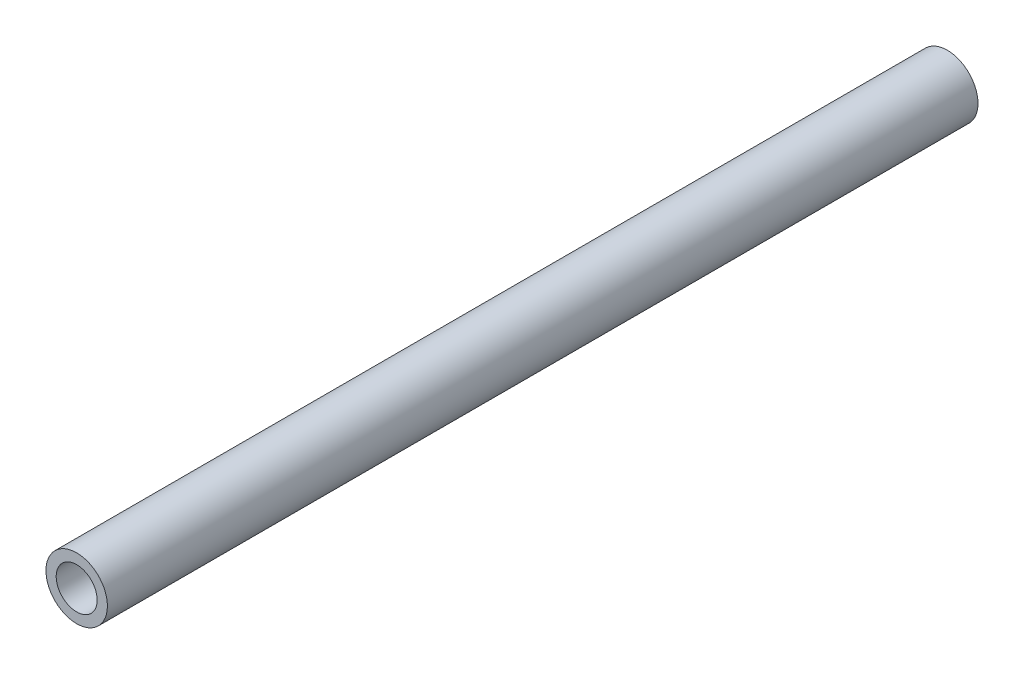
ISO-10303-21;
HEADER;
FILE_DESCRIPTION(('STEP AP214'),'2;1');
FILE_NAME('part.step','',(''),(''),'','','');
FILE_SCHEMA(('AUTOMOTIVE_DESIGN { 1 0 10303 214 1 1 1 1 }'));
ENDSEC;
DATA;
#1=APPLICATION_CONTEXT('core data for automotive mechanical design processes');
#2=APPLICATION_PROTOCOL_DEFINITION('international standard','automotive_design',2000,#1);
#3=PRODUCT_CONTEXT('',#1,'mechanical');
#4=PRODUCT('Part','Part','',(#3));
#5=PRODUCT_RELATED_PRODUCT_CATEGORY('part','',(#4));
#6=PRODUCT_DEFINITION_FORMATION('','',#4);
#7=PRODUCT_DEFINITION_CONTEXT('part definition',#1,'design');
#8=PRODUCT_DEFINITION('design','',#6,#7);
#9=PRODUCT_DEFINITION_SHAPE('','',#8);
#10=(LENGTH_UNIT() NAMED_UNIT(*) SI_UNIT(.MILLI.,.METRE.));
#11=(NAMED_UNIT(*) PLANE_ANGLE_UNIT() SI_UNIT($,.RADIAN.));
#12=(NAMED_UNIT(*) SI_UNIT($,.STERADIAN.) SOLID_ANGLE_UNIT());
#13=UNCERTAINTY_MEASURE_WITH_UNIT(LENGTH_MEASURE(1.E-05),#10,'distance_accuracy_value','');
#14=(GEOMETRIC_REPRESENTATION_CONTEXT(3) GLOBAL_UNCERTAINTY_ASSIGNED_CONTEXT((#13)) GLOBAL_UNIT_ASSIGNED_CONTEXT((#10,
#11,#12)) REPRESENTATION_CONTEXT('',''));
#15=CARTESIAN_POINT('',(0.,0.,0.));
#16=DIRECTION('',(0.,0.,1.));
#17=DIRECTION('',(1.,0.,0.));
#18=AXIS2_PLACEMENT_3D('',#15,#16,#17);
#19=CARTESIAN_POINT('',(0.,0.,539.75));
#20=DIRECTION('',(0.,0.,-1.));
#21=DIRECTION('',(-1.,0.,0.));
#22=AXIS2_PLACEMENT_3D('',#19,#20,#21);
#23=CYLINDRICAL_SURFACE('',#22,19.05);
#24=CARTESIAN_POINT('',(0.,0.,539.75));
#25=DIRECTION('',(0.,0.,1.));
#26=DIRECTION('',(1.,0.,0.));
#27=AXIS2_PLACEMENT_3D('',#24,#25,#26);
#28=CIRCLE('',#27,19.05);
#29=CARTESIAN_POINT('',(19.05,0.,539.75));
#30=VERTEX_POINT('',#29);
#31=EDGE_CURVE('E10',#30,#30,#28,.T.);
#32=ORIENTED_EDGE('',*,*,#31,.F.);
#33=EDGE_LOOP('',(#32));
#34=FACE_BOUND('',#33,.T.);
#35=CARTESIAN_POINT('',(0.,0.,0.));
#36=DIRECTION('',(0.,0.,1.));
#37=DIRECTION('',(1.,0.,0.));
#38=AXIS2_PLACEMENT_3D('',#35,#36,#37);
#39=CIRCLE('',#38,19.05);
#40=CARTESIAN_POINT('',(19.05,0.,0.));
#41=VERTEX_POINT('',#40);
#42=EDGE_CURVE('E35',#41,#41,#39,.T.);
#43=ORIENTED_EDGE('',*,*,#42,.T.);
#44=EDGE_LOOP('',(#43));
#45=FACE_BOUND('',#44,.T.);
#46=ADVANCED_FACE('F32',(#34,#45),#23,.T.);
#47=CARTESIAN_POINT('',(0.,0.,539.75));
#48=DIRECTION('',(0.,0.,1.));
#49=DIRECTION('',(1.,0.,0.));
#50=AXIS2_PLACEMENT_3D('',#47,#48,#49);
#51=PLANE('',#50);
#52=CARTESIAN_POINT('',(0.,0.,539.75));
#53=DIRECTION('',(0.,0.,1.));
#54=DIRECTION('',(1.,0.,0.));
#55=AXIS2_PLACEMENT_3D('',#52,#53,#54);
#56=CIRCLE('',#55,12.7);
#57=CARTESIAN_POINT('',(12.7,0.,539.75));
#58=VERTEX_POINT('',#57);
#59=EDGE_CURVE('E44',#58,#58,#56,.T.);
#60=ORIENTED_EDGE('',*,*,#59,.F.);
#61=EDGE_LOOP('',(#60));
#62=FACE_BOUND('',#61,.T.);
#63=ORIENTED_EDGE('',*,*,#31,.T.);
#64=EDGE_LOOP('',(#63));
#65=FACE_BOUND('',#64,.T.);
#66=ADVANCED_FACE('F59',(#62,#65),#51,.T.);
#67=CARTESIAN_POINT('',(0.,0.,0.));
#68=DIRECTION('',(0.,0.,1.));
#69=DIRECTION('',(1.,0.,0.));
#70=AXIS2_PLACEMENT_3D('',#67,#68,#69);
#71=PLANE('',#70);
#72=CARTESIAN_POINT('',(0.,0.,0.));
#73=DIRECTION('',(0.,0.,1.));
#74=DIRECTION('',(1.,0.,0.));
#75=AXIS2_PLACEMENT_3D('',#72,#73,#74);
#76=CIRCLE('',#75,12.7);
#77=CARTESIAN_POINT('',(12.7,0.,0.));
#78=VERTEX_POINT('',#77);
#79=EDGE_CURVE('E42',#78,#78,#76,.T.);
#80=ORIENTED_EDGE('',*,*,#79,.T.);
#81=EDGE_LOOP('',(#80));
#82=FACE_BOUND('',#81,.T.);
#83=ORIENTED_EDGE('',*,*,#42,.F.);
#84=EDGE_LOOP('',(#83));
#85=FACE_BOUND('',#84,.T.);
#86=ADVANCED_FACE('F50',(#82,#85),#71,.F.);
#87=CARTESIAN_POINT('',(0.,0.,0.));
#88=DIRECTION('',(0.,0.,1.));
#89=DIRECTION('',(1.,0.,0.));
#90=AXIS2_PLACEMENT_3D('',#87,#88,#89);
#91=CYLINDRICAL_SURFACE('',#90,12.7);
#92=ORIENTED_EDGE('',*,*,#79,.F.);
#93=EDGE_LOOP('',(#92));
#94=FACE_BOUND('',#93,.T.);
#95=ORIENTED_EDGE('',*,*,#59,.T.);
#96=EDGE_LOOP('',(#95));
#97=FACE_BOUND('',#96,.T.);
#98=ADVANCED_FACE('F53',(#94,#97),#91,.F.);
#99=CLOSED_SHELL('',(#46,#66,#86,#98));
#100=MANIFOLD_SOLID_BREP('B2',#99);
#101=ADVANCED_BREP_SHAPE_REPRESENTATION('',(#18,#100),#14);
#102=SHAPE_DEFINITION_REPRESENTATION(#9,#101);
ENDSEC;
END-ISO-10303-21;
